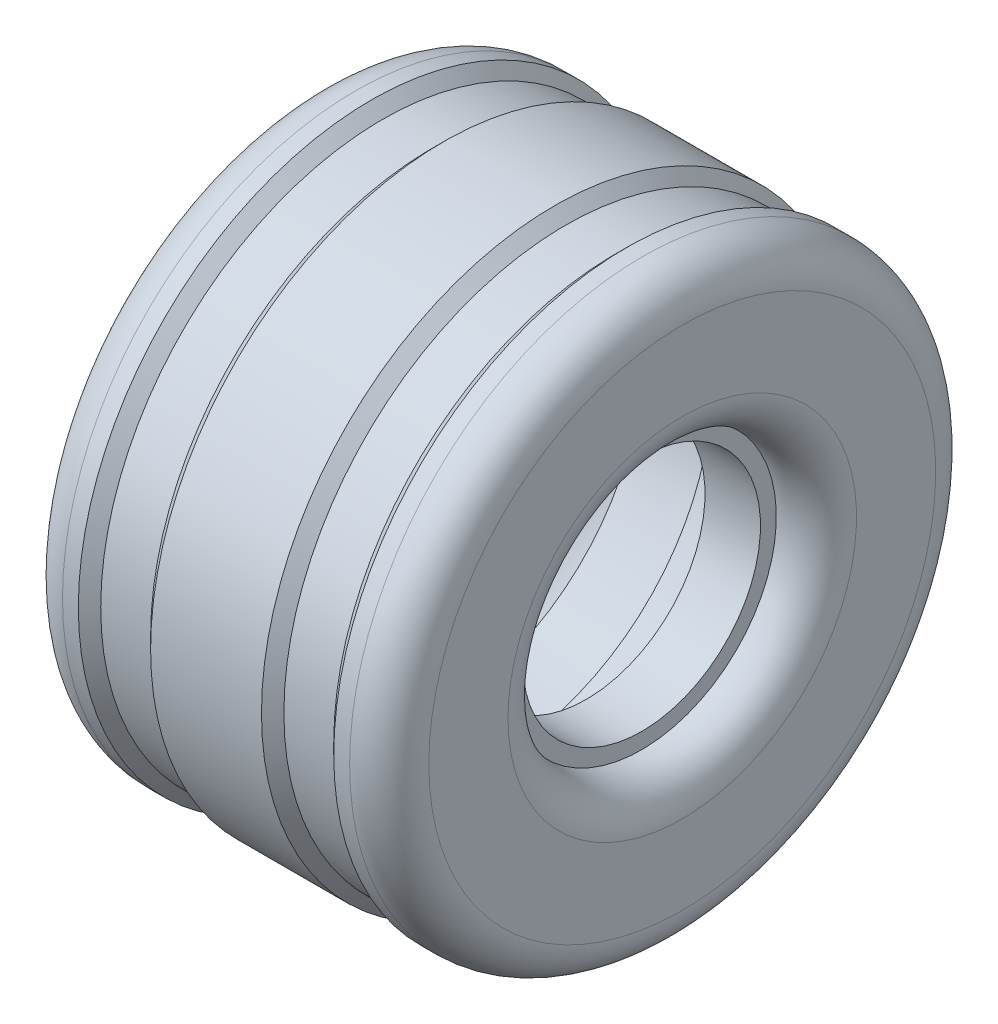
ISO-10303-21;
HEADER;
FILE_DESCRIPTION(('STEP AP214'),'2;1');
FILE_NAME('part.step','',(''),(''),'','','');
FILE_SCHEMA(('AUTOMOTIVE_DESIGN { 1 0 10303 214 1 1 1 1 }'));
ENDSEC;
DATA;
#1=APPLICATION_CONTEXT('core data for automotive mechanical design processes');
#2=APPLICATION_PROTOCOL_DEFINITION('international standard','automotive_design',2000,#1);
#3=PRODUCT_CONTEXT('',#1,'mechanical');
#4=PRODUCT('Part','Part','',(#3));
#5=PRODUCT_RELATED_PRODUCT_CATEGORY('part','',(#4));
#6=PRODUCT_DEFINITION_FORMATION('','',#4);
#7=PRODUCT_DEFINITION_CONTEXT('part definition',#1,'design');
#8=PRODUCT_DEFINITION('design','',#6,#7);
#9=PRODUCT_DEFINITION_SHAPE('','',#8);
#10=(LENGTH_UNIT() NAMED_UNIT(*) SI_UNIT(.MILLI.,.METRE.));
#11=(NAMED_UNIT(*) PLANE_ANGLE_UNIT() SI_UNIT($,.RADIAN.));
#12=(NAMED_UNIT(*) SI_UNIT($,.STERADIAN.) SOLID_ANGLE_UNIT());
#13=UNCERTAINTY_MEASURE_WITH_UNIT(LENGTH_MEASURE(1.E-05),#10,'distance_accuracy_value','');
#14=(GEOMETRIC_REPRESENTATION_CONTEXT(3) GLOBAL_UNCERTAINTY_ASSIGNED_CONTEXT((#13)) GLOBAL_UNIT_ASSIGNED_CONTEXT((#10,
#11,#12)) REPRESENTATION_CONTEXT('',''));
#15=CARTESIAN_POINT('',(0.,0.,0.));
#16=DIRECTION('',(0.,0.,1.));
#17=DIRECTION('',(1.,0.,0.));
#18=AXIS2_PLACEMENT_3D('',#15,#16,#17);
#19=CARTESIAN_POINT('',(0.,0.,0.));
#20=DIRECTION('',(-1.,0.,0.));
#21=DIRECTION('',(0.,0.,1.));
#22=AXIS2_PLACEMENT_3D('',#19,#20,#21);
#23=CYLINDRICAL_SURFACE('',#22,369.984724907136);
#24=CARTESIAN_POINT('',(-1.23583006838366,0.,0.));
#25=DIRECTION('',(-1.,0.,0.));
#26=DIRECTION('',(0.,0.,1.));
#27=AXIS2_PLACEMENT_3D('',#24,#25,#26);
#28=CIRCLE('',#27,369.984724907136);
#29=CARTESIAN_POINT('',(-1.23583006838366,0.,369.984724907136));
#30=VERTEX_POINT('',#29);
#31=EDGE_CURVE('E10',#30,#30,#28,.T.);
#32=ORIENTED_EDGE('',*,*,#31,.F.);
#33=EDGE_LOOP('',(#32));
#34=FACE_BOUND('',#33,.T.);
#35=CARTESIAN_POINT('',(18.7641699316163,0.,0.));
#36=DIRECTION('',(-1.,0.,0.));
#37=DIRECTION('',(0.,0.,1.));
#38=AXIS2_PLACEMENT_3D('',#35,#36,#37);
#39=CIRCLE('',#38,369.984724907136);
#40=CARTESIAN_POINT('',(18.7641699316163,0.,369.984724907136));
#41=VERTEX_POINT('',#40);
#42=EDGE_CURVE('E117',#41,#41,#39,.T.);
#43=ORIENTED_EDGE('',*,*,#42,.T.);
#44=EDGE_LOOP('',(#43));
#45=FACE_BOUND('',#44,.T.);
#46=ADVANCED_FACE('F40',(#34,#45),#23,.T.);
#47=CARTESIAN_POINT('',(-1.23583006838365,0.,0.));
#48=DIRECTION('',(-1.,0.,0.));
#49=DIRECTION('',(0.,0.,1.));
#50=AXIS2_PLACEMENT_3D('',#47,#48,#49);
#51=TOROIDAL_SURFACE('',#50,319.984724907136,50.);
#52=CARTESIAN_POINT('',(-51.2358300683837,0.,0.));
#53=DIRECTION('',(-1.,0.,0.));
#54=DIRECTION('',(0.,0.,1.));
#55=AXIS2_PLACEMENT_3D('',#52,#53,#54);
#56=CIRCLE('',#55,319.984724907136);
#57=CARTESIAN_POINT('',(-51.2358300683837,0.,319.984724907136));
#58=VERTEX_POINT('',#57);
#59=EDGE_CURVE('E43',#58,#58,#56,.T.);
#60=ORIENTED_EDGE('',*,*,#59,.F.);
#61=EDGE_LOOP('',(#60));
#62=FACE_BOUND('',#61,.T.);
#63=ORIENTED_EDGE('',*,*,#31,.T.);
#64=EDGE_LOOP('',(#63));
#65=FACE_BOUND('',#64,.T.);
#66=ADVANCED_FACE('F170',(#62,#65),#51,.T.);
#67=CARTESIAN_POINT('',(-51.2358300683837,319.984724907136,0.));
#68=DIRECTION('',(1.,0.,0.));
#69=DIRECTION('',(0.,0.,-1.));
#70=AXIS2_PLACEMENT_3D('',#67,#68,#69);
#71=PLANE('',#70);
#72=CARTESIAN_POINT('',(-51.2358300683836,0.,0.));
#73=DIRECTION('',(-1.,0.,0.));
#74=DIRECTION('',(0.,0.,1.));
#75=AXIS2_PLACEMENT_3D('',#72,#73,#74);
#76=CIRCLE('',#75,219.984724907136);
#77=CARTESIAN_POINT('',(-51.2358300683836,0.,219.984724907136));
#78=VERTEX_POINT('',#77);
#79=EDGE_CURVE('E50',#78,#78,#76,.T.);
#80=ORIENTED_EDGE('',*,*,#79,.F.);
#81=EDGE_LOOP('',(#80));
#82=FACE_BOUND('',#81,.T.);
#83=ORIENTED_EDGE('',*,*,#59,.T.);
#84=EDGE_LOOP('',(#83));
#85=FACE_BOUND('',#84,.T.);
#86=ADVANCED_FACE('F163',(#82,#85),#71,.F.);
#87=CARTESIAN_POINT('',(-1.23583006838364,0.,0.));
#88=DIRECTION('',(-1.,0.,0.));
#89=DIRECTION('',(0.,0.,1.));
#90=AXIS2_PLACEMENT_3D('',#87,#88,#89);
#91=TOROIDAL_SURFACE('',#90,219.984724907136,50.);
#92=CARTESIAN_POINT('',(0.,0.,0.));
#93=DIRECTION('',(-1.,0.,0.));
#94=DIRECTION('',(0.,0.,1.));
#95=AXIS2_PLACEMENT_3D('',#92,#93,#94);
#96=CIRCLE('',#95,170.);
#97=CARTESIAN_POINT('',(0.,0.,170.));
#98=VERTEX_POINT('',#97);
#99=EDGE_CURVE('E51',#98,#98,#96,.T.);
#100=ORIENTED_EDGE('',*,*,#99,.F.);
#101=EDGE_LOOP('',(#100));
#102=FACE_BOUND('',#101,.T.);
#103=ORIENTED_EDGE('',*,*,#79,.T.);
#104=EDGE_LOOP('',(#103));
#105=FACE_BOUND('',#104,.T.);
#106=ADVANCED_FACE('F159',(#102,#105),#91,.T.);
#107=CARTESIAN_POINT('',(0.,170.,0.));
#108=DIRECTION('',(1.,0.,0.));
#109=DIRECTION('',(0.,0.,-1.));
#110=AXIS2_PLACEMENT_3D('',#107,#108,#109);
#111=PLANE('',#110);
#112=CARTESIAN_POINT('',(0.,0.,0.));
#113=DIRECTION('',(-1.,0.,0.));
#114=DIRECTION('',(0.,0.,1.));
#115=AXIS2_PLACEMENT_3D('',#112,#113,#114);
#116=CIRCLE('',#115,150.);
#117=CARTESIAN_POINT('',(0.,0.,150.));
#118=VERTEX_POINT('',#117);
#119=EDGE_CURVE('E57',#118,#118,#116,.T.);
#120=ORIENTED_EDGE('',*,*,#119,.F.);
#121=EDGE_LOOP('',(#120));
#122=FACE_BOUND('',#121,.T.);
#123=ORIENTED_EDGE('',*,*,#99,.T.);
#124=EDGE_LOOP('',(#123));
#125=FACE_BOUND('',#124,.T.);
#126=ADVANCED_FACE('F156',(#122,#125),#111,.F.);
#127=CARTESIAN_POINT('',(0.,0.,0.));
#128=DIRECTION('',(-1.,0.,0.));
#129=DIRECTION('',(0.,0.,1.));
#130=AXIS2_PLACEMENT_3D('',#127,#128,#129);
#131=CYLINDRICAL_SURFACE('',#130,150.);
#132=CARTESIAN_POINT('',(70.,0.,0.));
#133=DIRECTION('',(-1.,0.,0.));
#134=DIRECTION('',(0.,0.,1.));
#135=AXIS2_PLACEMENT_3D('',#132,#133,#134);
#136=CIRCLE('',#135,150.);
#137=CARTESIAN_POINT('',(70.,0.,150.));
#138=VERTEX_POINT('',#137);
#139=EDGE_CURVE('E56',#138,#138,#136,.T.);
#140=ORIENTED_EDGE('',*,*,#139,.F.);
#141=EDGE_LOOP('',(#140));
#142=FACE_BOUND('',#141,.T.);
#143=ORIENTED_EDGE('',*,*,#119,.T.);
#144=EDGE_LOOP('',(#143));
#145=FACE_BOUND('',#144,.T.);
#146=ADVANCED_FACE('F155',(#142,#145),#131,.F.);
#147=CARTESIAN_POINT('',(70.,170.,0.));
#148=DIRECTION('',(-1.,0.,0.));
#149=DIRECTION('',(0.,0.,1.));
#150=AXIS2_PLACEMENT_3D('',#147,#148,#149);
#151=PLANE('',#150);
#152=CARTESIAN_POINT('',(70.,0.,0.));
#153=DIRECTION('',(-1.,0.,0.));
#154=DIRECTION('',(0.,0.,1.));
#155=AXIS2_PLACEMENT_3D('',#152,#153,#154);
#156=CIRCLE('',#155,220.);
#157=CARTESIAN_POINT('',(70.,0.,220.));
#158=VERTEX_POINT('',#157);
#159=EDGE_CURVE('E64',#158,#158,#156,.T.);
#160=ORIENTED_EDGE('',*,*,#159,.F.);
#161=EDGE_LOOP('',(#160));
#162=FACE_BOUND('',#161,.T.);
#163=ORIENTED_EDGE('',*,*,#139,.T.);
#164=EDGE_LOOP('',(#163));
#165=FACE_BOUND('',#164,.T.);
#166=ADVANCED_FACE('F146',(#162,#165),#151,.F.);
#167=CARTESIAN_POINT('',(70.,220.,0.));
#168=CARTESIAN_POINT('',(64.7550118436188,231.203943167838,0.));
#169=CARTESIAN_POINT('',(103.433962177216,257.238059584157,0.));
#170=B_SPLINE_CURVE_WITH_KNOTS('',2,(#167,#168,#169),.UNSPECIFIED.,.F.,.F.,(3,3),(0.,
0.545738693268138),.UNSPECIFIED.);
#171=CARTESIAN_POINT('',(0.,0.,0.));
#172=DIRECTION('',(-1.,0.,0.));
#173=AXIS1_PLACEMENT('',#171,#172);
#174=SURFACE_OF_REVOLUTION('',#170,#173);
#175=CARTESIAN_POINT('',(103.433962177216,0.,0.));
#176=DIRECTION('',(-1.,0.,0.));
#177=DIRECTION('',(0.,0.,1.));
#178=AXIS2_PLACEMENT_3D('',#175,#176,#177);
#179=CIRCLE('',#178,257.238059584157);
#180=CARTESIAN_POINT('',(103.433962177216,0.,257.238059584157));
#181=VERTEX_POINT('',#180);
#182=EDGE_CURVE('E63',#181,#181,#179,.T.);
#183=ORIENTED_EDGE('',*,*,#182,.F.);
#184=EDGE_LOOP('',(#183));
#185=FACE_BOUND('',#184,.T.);
#186=ORIENTED_EDGE('',*,*,#159,.T.);
#187=EDGE_LOOP('',(#186));
#188=FACE_BOUND('',#187,.T.);
#189=ADVANCED_FACE('F145',(#185,#188),#174,.T.);
#190=CARTESIAN_POINT('',(103.433962177216,0.,0.));
#191=DIRECTION('',(1.,0.,0.));
#192=DIRECTION('',(0.,0.,-1.));
#193=AXIS2_PLACEMENT_3D('',#190,#191,#192);
#194=CONICAL_SURFACE('',#193,257.238059584157,0.143213420671378);
#195=CARTESIAN_POINT('',(180.,0.,0.));
#196=DIRECTION('',(-1.,0.,0.));
#197=DIRECTION('',(0.,0.,1.));
#198=AXIS2_PLACEMENT_3D('',#195,#196,#197);
#199=CIRCLE('',#198,268.278930241988);
#200=CARTESIAN_POINT('',(180.,0.,268.278930241988));
#201=VERTEX_POINT('',#200);
#202=EDGE_CURVE('E68',#201,#201,#199,.T.);
#203=ORIENTED_EDGE('',*,*,#202,.F.);
#204=EDGE_LOOP('',(#203));
#205=FACE_BOUND('',#204,.T.);
#206=ORIENTED_EDGE('',*,*,#182,.T.);
#207=EDGE_LOOP('',(#206));
#208=FACE_BOUND('',#207,.T.);
#209=ADVANCED_FACE('F136',(#205,#208),#194,.F.);
#210=CARTESIAN_POINT('',(180.,0.,0.));
#211=DIRECTION('',(-1.,0.,0.));
#212=DIRECTION('',(0.,0.,1.));
#213=AXIS2_PLACEMENT_3D('',#210,#211,#212);
#214=CONICAL_SURFACE('',#213,268.278930241988,0.143213420671378);
#215=CARTESIAN_POINT('',(256.566037822784,0.,0.));
#216=DIRECTION('',(-1.,0.,0.));
#217=DIRECTION('',(0.,0.,1.));
#218=AXIS2_PLACEMENT_3D('',#215,#216,#217);
#219=CIRCLE('',#218,257.238059584157);
#220=CARTESIAN_POINT('',(256.566037822784,0.,257.238059584157));
#221=VERTEX_POINT('',#220);
#222=EDGE_CURVE('E72',#221,#221,#219,.T.);
#223=ORIENTED_EDGE('',*,*,#222,.F.);
#224=EDGE_LOOP('',(#223));
#225=FACE_BOUND('',#224,.T.);
#226=ORIENTED_EDGE('',*,*,#202,.T.);
#227=EDGE_LOOP('',(#226));
#228=FACE_BOUND('',#227,.T.);
#229=ADVANCED_FACE('F133',(#225,#228),#214,.F.);
#230=CARTESIAN_POINT('',(256.566037822784,257.238059584157,0.));
#231=CARTESIAN_POINT('',(295.244988156381,231.203943167838,0.));
#232=CARTESIAN_POINT('',(290.,220.,0.));
#233=B_SPLINE_CURVE_WITH_KNOTS('',2,(#230,#231,#232),.UNSPECIFIED.,.F.,.F.,(3,3),(0.,
0.545738693268138),.UNSPECIFIED.);
#234=CARTESIAN_POINT('',(0.,0.,0.));
#235=DIRECTION('',(-1.,0.,0.));
#236=AXIS1_PLACEMENT('',#234,#235);
#237=SURFACE_OF_REVOLUTION('',#233,#236);
#238=CARTESIAN_POINT('',(290.,0.,0.));
#239=DIRECTION('',(-1.,0.,0.));
#240=DIRECTION('',(0.,0.,1.));
#241=AXIS2_PLACEMENT_3D('',#238,#239,#240);
#242=CIRCLE('',#241,220.);
#243=CARTESIAN_POINT('',(290.,0.,220.));
#244=VERTEX_POINT('',#243);
#245=EDGE_CURVE('E74',#244,#244,#242,.T.);
#246=ORIENTED_EDGE('',*,*,#245,.F.);
#247=EDGE_LOOP('',(#246));
#248=FACE_BOUND('',#247,.T.);
#249=ORIENTED_EDGE('',*,*,#222,.T.);
#250=EDGE_LOOP('',(#249));
#251=FACE_BOUND('',#250,.T.);
#252=ADVANCED_FACE('F128',(#248,#251),#237,.T.);
#253=CARTESIAN_POINT('',(290.,150.,0.));
#254=DIRECTION('',(1.,0.,0.));
#255=DIRECTION('',(0.,0.,-1.));
#256=AXIS2_PLACEMENT_3D('',#253,#254,#255);
#257=PLANE('',#256);
#258=CARTESIAN_POINT('',(290.,0.,0.));
#259=DIRECTION('',(-1.,0.,0.));
#260=DIRECTION('',(0.,0.,1.));
#261=AXIS2_PLACEMENT_3D('',#258,#259,#260);
#262=CIRCLE('',#261,150.);
#263=CARTESIAN_POINT('',(290.,0.,150.));
#264=VERTEX_POINT('',#263);
#265=EDGE_CURVE('E79',#264,#264,#262,.T.);
#266=ORIENTED_EDGE('',*,*,#265,.F.);
#267=EDGE_LOOP('',(#266));
#268=FACE_BOUND('',#267,.T.);
#269=ORIENTED_EDGE('',*,*,#245,.T.);
#270=EDGE_LOOP('',(#269));
#271=FACE_BOUND('',#270,.T.);
#272=ADVANCED_FACE('F131',(#268,#271),#257,.F.);
#273=CARTESIAN_POINT('',(0.,0.,0.));
#274=DIRECTION('',(-1.,0.,0.));
#275=DIRECTION('',(0.,0.,1.));
#276=AXIS2_PLACEMENT_3D('',#273,#274,#275);
#277=CYLINDRICAL_SURFACE('',#276,150.);
#278=CARTESIAN_POINT('',(360.,0.,0.));
#279=DIRECTION('',(-1.,0.,0.));
#280=DIRECTION('',(0.,0.,1.));
#281=AXIS2_PLACEMENT_3D('',#278,#279,#280);
#282=CIRCLE('',#281,150.);
#283=CARTESIAN_POINT('',(360.,0.,150.));
#284=VERTEX_POINT('',#283);
#285=EDGE_CURVE('E78',#284,#284,#282,.T.);
#286=ORIENTED_EDGE('',*,*,#285,.F.);
#287=EDGE_LOOP('',(#286));
#288=FACE_BOUND('',#287,.T.);
#289=ORIENTED_EDGE('',*,*,#265,.T.);
#290=EDGE_LOOP('',(#289));
#291=FACE_BOUND('',#290,.T.);
#292=ADVANCED_FACE('F249',(#288,#291),#277,.F.);
#293=CARTESIAN_POINT('',(360.,170.,0.));
#294=DIRECTION('',(-1.,0.,0.));
#295=DIRECTION('',(0.,0.,1.));
#296=AXIS2_PLACEMENT_3D('',#293,#294,#295);
#297=PLANE('',#296);
#298=CARTESIAN_POINT('',(360.,0.,0.));
#299=DIRECTION('',(-1.,0.,0.));
#300=DIRECTION('',(0.,0.,1.));
#301=AXIS2_PLACEMENT_3D('',#298,#299,#300);
#302=CIRCLE('',#301,170.);
#303=CARTESIAN_POINT('',(360.,0.,170.));
#304=VERTEX_POINT('',#303);
#305=EDGE_CURVE('E83',#304,#304,#302,.T.);
#306=ORIENTED_EDGE('',*,*,#305,.F.);
#307=EDGE_LOOP('',(#306));
#308=FACE_BOUND('',#307,.T.);
#309=ORIENTED_EDGE('',*,*,#285,.T.);
#310=EDGE_LOOP('',(#309));
#311=FACE_BOUND('',#310,.T.);
#312=ADVANCED_FACE('F245',(#308,#311),#297,.F.);
#313=CARTESIAN_POINT('',(361.235830068384,0.,0.));
#314=DIRECTION('',(-1.,0.,0.));
#315=DIRECTION('',(0.,0.,1.));
#316=AXIS2_PLACEMENT_3D('',#313,#314,#315);
#317=TOROIDAL_SURFACE('',#316,219.984724907136,50.);
#318=CARTESIAN_POINT('',(411.235827615336,0.,0.));
#319=DIRECTION('',(-1.,0.,0.));
#320=DIRECTION('',(0.,0.,1.));
#321=AXIS2_PLACEMENT_3D('',#318,#319,#320);
#322=CIRCLE('',#321,220.000387115819);
#323=CARTESIAN_POINT('',(411.235827615336,0.,220.000387115819));
#324=VERTEX_POINT('',#323);
#325=EDGE_CURVE('E88',#324,#324,#322,.T.);
#326=ORIENTED_EDGE('',*,*,#325,.F.);
#327=EDGE_LOOP('',(#326));
#328=FACE_BOUND('',#327,.T.);
#329=ORIENTED_EDGE('',*,*,#305,.T.);
#330=EDGE_LOOP('',(#329));
#331=FACE_BOUND('',#330,.T.);
#332=ADVANCED_FACE('F240',(#328,#331),#317,.T.);
#333=CARTESIAN_POINT('',(411.23582884186,319.984724907136,0.));
#334=DIRECTION('',(-1.,0.,0.));
#335=DIRECTION('',(0.,0.,1.));
#336=AXIS2_PLACEMENT_3D('',#333,#334,#335);
#337=PLANE('',#336);
#338=CARTESIAN_POINT('',(411.235830068384,0.,0.));
#339=DIRECTION('',(-1.,0.,0.));
#340=DIRECTION('',(0.,0.,1.));
#341=AXIS2_PLACEMENT_3D('',#338,#339,#340);
#342=CIRCLE('',#341,319.984724907136);
#343=CARTESIAN_POINT('',(411.235830068384,0.,319.984724907136));
#344=VERTEX_POINT('',#343);
#345=EDGE_CURVE('E90',#344,#344,#342,.T.);
#346=ORIENTED_EDGE('',*,*,#345,.F.);
#347=EDGE_LOOP('',(#346));
#348=FACE_BOUND('',#347,.T.);
#349=ORIENTED_EDGE('',*,*,#325,.T.);
#350=EDGE_LOOP('',(#349));
#351=FACE_BOUND('',#350,.T.);
#352=ADVANCED_FACE('F232',(#348,#351),#337,.F.);
#353=CARTESIAN_POINT('',(361.235830068384,0.,0.));
#354=DIRECTION('',(-1.,0.,0.));
#355=DIRECTION('',(0.,0.,1.));
#356=AXIS2_PLACEMENT_3D('',#353,#354,#355);
#357=TOROIDAL_SURFACE('',#356,319.984724907136,50.);
#358=CARTESIAN_POINT('',(361.235830068384,0.,0.));
#359=DIRECTION('',(-1.,0.,0.));
#360=DIRECTION('',(0.,0.,1.));
#361=AXIS2_PLACEMENT_3D('',#358,#359,#360);
#362=CIRCLE('',#361,369.984724907136);
#363=CARTESIAN_POINT('',(361.235830068384,0.,369.984724907136));
#364=VERTEX_POINT('',#363);
#365=EDGE_CURVE('E95',#364,#364,#362,.T.);
#366=ORIENTED_EDGE('',*,*,#365,.F.);
#367=EDGE_LOOP('',(#366));
#368=FACE_BOUND('',#367,.T.);
#369=ORIENTED_EDGE('',*,*,#345,.T.);
#370=EDGE_LOOP('',(#369));
#371=FACE_BOUND('',#370,.T.);
#372=ADVANCED_FACE('F223',(#368,#371),#357,.T.);
#373=CARTESIAN_POINT('',(0.,0.,0.));
#374=DIRECTION('',(-1.,0.,0.));
#375=DIRECTION('',(0.,0.,1.));
#376=AXIS2_PLACEMENT_3D('',#373,#374,#375);
#377=CYLINDRICAL_SURFACE('',#376,369.984724907136);
#378=CARTESIAN_POINT('',(341.235830068384,0.,0.));
#379=DIRECTION('',(-1.,0.,0.));
#380=DIRECTION('',(0.,0.,1.));
#381=AXIS2_PLACEMENT_3D('',#378,#379,#380);
#382=CIRCLE('',#381,369.984724907136);
#383=CARTESIAN_POINT('',(341.235830068384,0.,369.984724907136));
#384=VERTEX_POINT('',#383);
#385=EDGE_CURVE('E92',#384,#384,#382,.T.);
#386=ORIENTED_EDGE('',*,*,#385,.F.);
#387=EDGE_LOOP('',(#386));
#388=FACE_BOUND('',#387,.T.);
#389=ORIENTED_EDGE('',*,*,#365,.T.);
#390=EDGE_LOOP('',(#389));
#391=FACE_BOUND('',#390,.T.);
#392=ADVANCED_FACE('F218',(#388,#391),#377,.T.);
#393=CARTESIAN_POINT('',(341.235830068384,0.,0.));
#394=DIRECTION('',(1.,0.,0.));
#395=DIRECTION('',(0.,0.,-1.));
#396=AXIS2_PLACEMENT_3D('',#393,#394,#395);
#397=CONICAL_SURFACE('',#396,369.984724907136,0.785398163397452);
#398=CARTESIAN_POINT('',(327.093694444653,0.,0.));
#399=DIRECTION('',(-1.,0.,0.));
#400=DIRECTION('',(0.,0.,1.));
#401=AXIS2_PLACEMENT_3D('',#398,#399,#400);
#402=CIRCLE('',#401,355.842589283405);
#403=CARTESIAN_POINT('',(327.093694444653,0.,355.842589283405));
#404=VERTEX_POINT('',#403);
#405=EDGE_CURVE('E98',#404,#404,#402,.T.);
#406=ORIENTED_EDGE('',*,*,#405,.F.);
#407=EDGE_LOOP('',(#406));
#408=FACE_BOUND('',#407,.T.);
#409=ORIENTED_EDGE('',*,*,#385,.T.);
#410=EDGE_LOOP('',(#409));
#411=FACE_BOUND('',#410,.T.);
#412=ADVANCED_FACE('F213',(#408,#411),#397,.T.);
#413=CARTESIAN_POINT('',(0.,0.,0.));
#414=DIRECTION('',(-1.,0.,0.));
#415=DIRECTION('',(0.,0.,1.));
#416=AXIS2_PLACEMENT_3D('',#413,#414,#415);
#417=CYLINDRICAL_SURFACE('',#416,355.842589283405);
#418=CARTESIAN_POINT('',(264.142135623731,0.,0.));
#419=DIRECTION('',(-1.,0.,0.));
#420=DIRECTION('',(0.,0.,1.));
#421=AXIS2_PLACEMENT_3D('',#418,#419,#420);
#422=CIRCLE('',#421,355.842589283405);
#423=CARTESIAN_POINT('',(264.142135623731,0.,355.842589283405));
#424=VERTEX_POINT('',#423);
#425=EDGE_CURVE('E101',#424,#424,#422,.T.);
#426=ORIENTED_EDGE('',*,*,#425,.F.);
#427=EDGE_LOOP('',(#426));
#428=FACE_BOUND('',#427,.T.);
#429=ORIENTED_EDGE('',*,*,#405,.T.);
#430=EDGE_LOOP('',(#429));
#431=FACE_BOUND('',#430,.T.);
#432=ADVANCED_FACE('F210',(#428,#431),#417,.T.);
#433=CARTESIAN_POINT('',(264.142135623731,0.,0.));
#434=DIRECTION('',(-1.,0.,0.));
#435=DIRECTION('',(0.,0.,1.));
#436=AXIS2_PLACEMENT_3D('',#433,#434,#435);
#437=CONICAL_SURFACE('',#436,355.842589283405,0.785398163397446);
#438=CARTESIAN_POINT('',(250.,0.,0.));
#439=DIRECTION('',(-1.,0.,0.));
#440=DIRECTION('',(0.,0.,1.));
#441=AXIS2_PLACEMENT_3D('',#438,#439,#440);
#442=CIRCLE('',#441,369.984724907136);
#443=CARTESIAN_POINT('',(250.,0.,369.984724907136));
#444=VERTEX_POINT('',#443);
#445=EDGE_CURVE('E102',#444,#444,#442,.T.);
#446=ORIENTED_EDGE('',*,*,#445,.F.);
#447=EDGE_LOOP('',(#446));
#448=FACE_BOUND('',#447,.T.);
#449=ORIENTED_EDGE('',*,*,#425,.T.);
#450=EDGE_LOOP('',(#449));
#451=FACE_BOUND('',#450,.T.);
#452=ADVANCED_FACE('F203',(#448,#451),#437,.T.);
#453=CARTESIAN_POINT('',(0.,0.,0.));
#454=DIRECTION('',(-1.,0.,0.));
#455=DIRECTION('',(0.,0.,1.));
#456=AXIS2_PLACEMENT_3D('',#453,#454,#455);
#457=CYLINDRICAL_SURFACE('',#456,369.984724907136);
#458=CARTESIAN_POINT('',(110.,0.,0.));
#459=DIRECTION('',(-1.,0.,0.));
#460=DIRECTION('',(0.,0.,1.));
#461=AXIS2_PLACEMENT_3D('',#458,#459,#460);
#462=CIRCLE('',#461,369.984724907136);
#463=CARTESIAN_POINT('',(110.,0.,369.984724907136));
#464=VERTEX_POINT('',#463);
#465=EDGE_CURVE('E110',#464,#464,#462,.T.);
#466=ORIENTED_EDGE('',*,*,#465,.F.);
#467=EDGE_LOOP('',(#466));
#468=FACE_BOUND('',#467,.T.);
#469=ORIENTED_EDGE('',*,*,#445,.T.);
#470=EDGE_LOOP('',(#469));
#471=FACE_BOUND('',#470,.T.);
#472=ADVANCED_FACE('F191',(#468,#471),#457,.T.);
#473=CARTESIAN_POINT('',(110.,0.,0.));
#474=DIRECTION('',(1.,0.,0.));
#475=DIRECTION('',(0.,0.,-1.));
#476=AXIS2_PLACEMENT_3D('',#473,#474,#475);
#477=CONICAL_SURFACE('',#476,369.984724907136,0.785398163397445);
#478=CARTESIAN_POINT('',(95.857864376269,0.,0.));
#479=DIRECTION('',(-1.,0.,0.));
#480=DIRECTION('',(0.,0.,1.));
#481=AXIS2_PLACEMENT_3D('',#478,#479,#480);
#482=CIRCLE('',#481,355.842589283405);
#483=CARTESIAN_POINT('',(95.857864376269,0.,355.842589283405));
#484=VERTEX_POINT('',#483);
#485=EDGE_CURVE('E109',#484,#484,#482,.T.);
#486=ORIENTED_EDGE('',*,*,#485,.F.);
#487=EDGE_LOOP('',(#486));
#488=FACE_BOUND('',#487,.T.);
#489=ORIENTED_EDGE('',*,*,#465,.T.);
#490=EDGE_LOOP('',(#489));
#491=FACE_BOUND('',#490,.T.);
#492=ADVANCED_FACE('F186',(#488,#491),#477,.T.);
#493=CARTESIAN_POINT('',(0.,0.,0.));
#494=DIRECTION('',(-1.,0.,0.));
#495=DIRECTION('',(0.,0.,1.));
#496=AXIS2_PLACEMENT_3D('',#493,#494,#495);
#497=CYLINDRICAL_SURFACE('',#496,355.842589283405);
#498=CARTESIAN_POINT('',(32.9063055553472,0.,0.));
#499=DIRECTION('',(-1.,0.,0.));
#500=DIRECTION('',(0.,0.,1.));
#501=AXIS2_PLACEMENT_3D('',#498,#499,#500);
#502=CIRCLE('',#501,355.842589283405);
#503=CARTESIAN_POINT('',(32.9063055553472,0.,355.842589283405));
#504=VERTEX_POINT('',#503);
#505=EDGE_CURVE('E114',#504,#504,#502,.T.);
#506=ORIENTED_EDGE('',*,*,#505,.F.);
#507=EDGE_LOOP('',(#506));
#508=FACE_BOUND('',#507,.T.);
#509=ORIENTED_EDGE('',*,*,#485,.T.);
#510=EDGE_LOOP('',(#509));
#511=FACE_BOUND('',#510,.T.);
#512=ADVANCED_FACE('F181',(#508,#511),#497,.T.);
#513=CARTESIAN_POINT('',(32.9063055553472,0.,0.));
#514=DIRECTION('',(-1.,0.,0.));
#515=DIRECTION('',(0.,0.,1.));
#516=AXIS2_PLACEMENT_3D('',#513,#514,#515);
#517=CONICAL_SURFACE('',#516,355.842589283405,0.785398163397454);
#518=ORIENTED_EDGE('',*,*,#42,.F.);
#519=EDGE_LOOP('',(#518));
#520=FACE_BOUND('',#519,.T.);
#521=ORIENTED_EDGE('',*,*,#505,.T.);
#522=EDGE_LOOP('',(#521));
#523=FACE_BOUND('',#522,.T.);
#524=ADVANCED_FACE('F176',(#520,#523),#517,.T.);
#525=CLOSED_SHELL('',(#46,#66,#86,#106,#126,#146,#166,#189,#209,#229,#252,#272,#292,#312,#332,
#352,#372,#392,#412,#432,#452,#472,#492,#512,#524));
#526=MANIFOLD_SOLID_BREP('B2',#525);
#527=ADVANCED_BREP_SHAPE_REPRESENTATION('',(#18,#526),#14);
#528=SHAPE_DEFINITION_REPRESENTATION(#9,#527);
ENDSEC;
END-ISO-10303-21;
